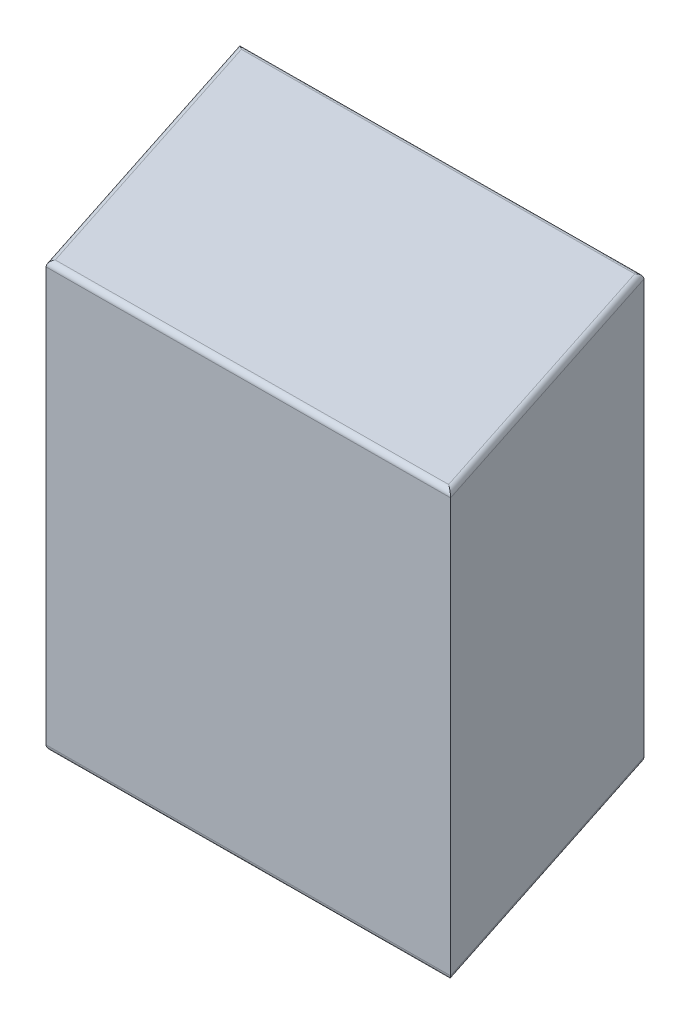
ISO-10303-21;
HEADER;
FILE_DESCRIPTION(('STEP AP214'),'2;1');
FILE_NAME('part.step','',(''),(''),'','','');
FILE_SCHEMA(('AUTOMOTIVE_DESIGN { 1 0 10303 214 1 1 1 1 }'));
ENDSEC;
DATA;
#1=APPLICATION_CONTEXT('core data for automotive mechanical design processes');
#2=APPLICATION_PROTOCOL_DEFINITION('international standard','automotive_design',2000,#1);
#3=PRODUCT_CONTEXT('',#1,'mechanical');
#4=PRODUCT('Part','Part','',(#3));
#5=PRODUCT_RELATED_PRODUCT_CATEGORY('part','',(#4));
#6=PRODUCT_DEFINITION_FORMATION('','',#4);
#7=PRODUCT_DEFINITION_CONTEXT('part definition',#1,'design');
#8=PRODUCT_DEFINITION('design','',#6,#7);
#9=PRODUCT_DEFINITION_SHAPE('','',#8);
#10=(LENGTH_UNIT() NAMED_UNIT(*) SI_UNIT(.MILLI.,.METRE.));
#11=(NAMED_UNIT(*) PLANE_ANGLE_UNIT() SI_UNIT($,.RADIAN.));
#12=(NAMED_UNIT(*) SI_UNIT($,.STERADIAN.) SOLID_ANGLE_UNIT());
#13=UNCERTAINTY_MEASURE_WITH_UNIT(LENGTH_MEASURE(1.E-05),#10,'distance_accuracy_value','');
#14=(GEOMETRIC_REPRESENTATION_CONTEXT(3) GLOBAL_UNCERTAINTY_ASSIGNED_CONTEXT((#13)) GLOBAL_UNIT_ASSIGNED_CONTEXT((#10,
#11,#12)) REPRESENTATION_CONTEXT('',''));
#15=CARTESIAN_POINT('',(0.,0.,0.));
#16=DIRECTION('',(0.,0.,1.));
#17=DIRECTION('',(1.,0.,0.));
#18=AXIS2_PLACEMENT_3D('',#15,#16,#17);
#19=CARTESIAN_POINT('',(38.2775881618389,40.,-0.133334243053111));
#20=DIRECTION('',(-0.00572683030423124,0.,-0.999983601572879));
#21=DIRECTION('',(-0.999983601572879,0.,0.00572683030423124));
#22=AXIS2_PLACEMENT_3D('',#19,#20,#21);
#23=PLANE('',#22);
#24=DIRECTION('',(0.,-1.,0.));
#25=VECTOR('',#24,1.);
#26=CARTESIAN_POINT('',(0.376890978613207,40.,0.0837201774783735));
#27=LINE('',#26,#25);
#28=CARTESIAN_POINT('',(0.376890978613207,39.5,0.0837201774783735));
#29=VERTEX_POINT('',#28);
#30=CARTESIAN_POINT('',(0.376890978613207,0.5,0.0837201774783735));
#31=VERTEX_POINT('',#30);
#32=EDGE_CURVE('E163',#29,#31,#27,.T.);
#33=ORIENTED_EDGE('',*,*,#32,.T.);
#34=DIRECTION('',(0.999983601572879,0.,-0.00572683030423124));
#35=VECTOR('',#34,1.);
#36=CARTESIAN_POINT('',(38.2775881618389,0.5,-0.133334243053111));
#37=LINE('',#36,#35);
#38=CARTESIAN_POINT('',(38.2775881618389,0.5,-0.133334243053111));
#39=VERTEX_POINT('',#38);
#40=EDGE_CURVE('E130',#31,#39,#37,.T.);
#41=ORIENTED_EDGE('',*,*,#40,.T.);
#42=DIRECTION('',(0.,-1.,0.));
#43=VECTOR('',#42,1.);
#44=CARTESIAN_POINT('',(38.2775881618389,40.,-0.133334243053111));
#45=LINE('',#44,#43);
#46=CARTESIAN_POINT('',(38.2775881618389,39.5,-0.133334243053111));
#47=VERTEX_POINT('',#46);
#48=EDGE_CURVE('E114',#47,#39,#45,.T.);
#49=ORIENTED_EDGE('',*,*,#48,.F.);
#50=DIRECTION('',(0.999983601572879,0.,-0.00572683030423124));
#51=VECTOR('',#50,1.);
#52=CARTESIAN_POINT('',(38.2775881618389,39.5,-0.133334243053111));
#53=LINE('',#52,#51);
#54=EDGE_CURVE('E127',#47,#29,#53,.F.);
#55=ORIENTED_EDGE('',*,*,#54,.T.);
#56=EDGE_LOOP('',(#33,#41,#49,#55));
#57=FACE_BOUND('',#56,.T.);
#58=ADVANCED_FACE('F43',(#57),#23,.F.);
#59=CARTESIAN_POINT('',(29.537452899368,40.,-27.0837229155534));
#60=DIRECTION('',(-0.951228322201496,0.,0.308487729159083));
#61=DIRECTION('',(0.308487729159083,0.,0.951228322201496));
#62=AXIS2_PLACEMENT_3D('',#59,#60,#61);
#63=PLANE('',#62);
#64=ORIENTED_EDGE('',*,*,#48,.T.);
#65=DIRECTION('',(-0.308487729159083,0.,-0.951228322201496));
#66=VECTOR('',#65,1.);
#67=CARTESIAN_POINT('',(29.537452899368,0.5,-27.0837229155534));
#68=LINE('',#67,#66);
#69=CARTESIAN_POINT('',(29.537452899368,0.5,-27.0837229155534));
#70=VERTEX_POINT('',#69);
#71=EDGE_CURVE('E120',#39,#70,#68,.T.);
#72=ORIENTED_EDGE('',*,*,#71,.T.);
#73=DIRECTION('',(0.,-1.,0.));
#74=VECTOR('',#73,1.);
#75=CARTESIAN_POINT('',(29.537452899368,40.,-27.0837229155534));
#76=LINE('',#75,#74);
#77=CARTESIAN_POINT('',(29.537452899368,39.5,-27.0837229155534));
#78=VERTEX_POINT('',#77);
#79=EDGE_CURVE('E116',#78,#70,#76,.T.);
#80=ORIENTED_EDGE('',*,*,#79,.F.);
#81=DIRECTION('',(-0.308487729159083,0.,-0.951228322201496));
#82=VECTOR('',#81,1.);
#83=CARTESIAN_POINT('',(29.537452899368,39.5,-27.0837229155534));
#84=LINE('',#83,#82);
#85=EDGE_CURVE('E111',#78,#47,#84,.F.);
#86=ORIENTED_EDGE('',*,*,#85,.T.);
#87=EDGE_LOOP('',(#64,#72,#80,#86));
#88=FACE_BOUND('',#87,.T.);
#89=ADVANCED_FACE('F113',(#88),#63,.F.);
#90=CARTESIAN_POINT('',(-8.36324428385767,40.,-26.866668495022));
#91=DIRECTION('',(0.005726830304231,0.,0.999983601572879));
#92=DIRECTION('',(0.999983601572879,0.,-0.005726830304231));
#93=AXIS2_PLACEMENT_3D('',#90,#91,#92);
#94=PLANE('',#93);
#95=ORIENTED_EDGE('',*,*,#79,.T.);
#96=DIRECTION('',(-0.999983601572879,0.,0.005726830304231));
#97=VECTOR('',#96,1.);
#98=CARTESIAN_POINT('',(-8.36324428385767,0.5,-26.866668495022));
#99=LINE('',#98,#97);
#100=CARTESIAN_POINT('',(-8.36324428385767,0.5,-26.866668495022));
#101=VERTEX_POINT('',#100);
#102=EDGE_CURVE('E187',#70,#101,#99,.T.);
#103=ORIENTED_EDGE('',*,*,#102,.T.);
#104=DIRECTION('',(0.,-1.,0.));
#105=VECTOR('',#104,1.);
#106=CARTESIAN_POINT('',(-8.36324428385767,40.,-26.866668495022));
#107=LINE('',#106,#105);
#108=CARTESIAN_POINT('',(-8.36324428385767,39.5,-26.866668495022));
#109=VERTEX_POINT('',#108);
#110=EDGE_CURVE('E168',#109,#101,#107,.T.);
#111=ORIENTED_EDGE('',*,*,#110,.F.);
#112=DIRECTION('',(-0.999983601572879,0.,0.005726830304231));
#113=VECTOR('',#112,1.);
#114=CARTESIAN_POINT('',(-8.36324428385767,39.5,-26.866668495022));
#115=LINE('',#114,#113);
#116=EDGE_CURVE('E185',#109,#78,#115,.F.);
#117=ORIENTED_EDGE('',*,*,#116,.T.);
#118=EDGE_LOOP('',(#95,#103,#111,#117));
#119=FACE_BOUND('',#118,.T.);
#120=ADVANCED_FACE('F204',(#119),#94,.F.);
#121=CARTESIAN_POINT('',(0.376890978613207,40.,0.0837201774783735));
#122=DIRECTION('',(0.951228322201496,0.,-0.308487729159083));
#123=DIRECTION('',(-0.308487729159083,0.,-0.951228322201496));
#124=AXIS2_PLACEMENT_3D('',#121,#122,#123);
#125=PLANE('',#124);
#126=ORIENTED_EDGE('',*,*,#110,.T.);
#127=DIRECTION('',(0.308487729159083,0.,0.951228322201496));
#128=VECTOR('',#127,1.);
#129=CARTESIAN_POINT('',(0.376890978613207,0.5,0.0837201774783734));
#130=LINE('',#129,#128);
#131=EDGE_CURVE('E191',#101,#31,#130,.T.);
#132=ORIENTED_EDGE('',*,*,#131,.T.);
#133=ORIENTED_EDGE('',*,*,#32,.F.);
#134=DIRECTION('',(0.308487729159083,0.,0.951228322201496));
#135=VECTOR('',#134,1.);
#136=CARTESIAN_POINT('',(0.376890978613207,39.5,0.0837201774783735));
#137=LINE('',#136,#135);
#138=EDGE_CURVE('E189',#29,#109,#137,.F.);
#139=ORIENTED_EDGE('',*,*,#138,.T.);
#140=EDGE_LOOP('',(#126,#132,#133,#139));
#141=FACE_BOUND('',#140,.T.);
#142=ADVANCED_FACE('F202',(#141),#125,.F.);
#143=CARTESIAN_POINT('',(0.,40.,0.));
#144=DIRECTION('',(0.,-1.,0.));
#145=DIRECTION('',(0.,0.,-1.));
#146=AXIS2_PLACEMENT_3D('',#143,#144,#145);
#147=PLANE('',#146);
#148=DIRECTION('',(0.308487729159083,0.,0.951228322201496));
#149=VECTOR('',#148,1.);
#150=CARTESIAN_POINT('',(0.792071392192727,40.,-0.256872403193278));
#151=LINE('',#150,#149);
#152=CARTESIAN_POINT('',(-7.67672820722288,40.,-26.3705919212184));
#153=VERTEX_POINT('',#152);
#154=CARTESIAN_POINT('',(0.739698341823154,40.,-0.418365792144037));
#155=VERTEX_POINT('',#154);
#156=EDGE_CURVE('E193',#153,#155,#151,.T.);
#157=ORIENTED_EDGE('',*,*,#156,.T.);
#158=DIRECTION('',(0.999983601572879,0.,-0.00572683030423124));
#159=VECTOR('',#158,1.);
#160=CARTESIAN_POINT('',(-0.00237161102776172,40.,-0.414116013760509));
#161=LINE('',#160,#159);
#162=CARTESIAN_POINT('',(37.5910720852041,40.,-0.629410816856639));
#163=VERTEX_POINT('',#162);
#164=EDGE_CURVE('E11',#155,#163,#161,.T.);
#165=ORIENTED_EDGE('',*,*,#164,.T.);
#166=DIRECTION('',(-0.308487729159083,0.,-0.951228322201496));
#167=VECTOR('',#166,1.);
#168=CARTESIAN_POINT('',(34.1984255111126,40.,-11.090707015875));
#169=LINE('',#168,#167);
#170=CARTESIAN_POINT('',(29.1746455361581,40.,-26.581636945931));
#171=VERTEX_POINT('',#170);
#172=EDGE_CURVE('E52',#163,#171,#169,.T.);
#173=ORIENTED_EDGE('',*,*,#172,.T.);
#174=DIRECTION('',(-0.999983601572879,0.,0.005726830304231));
#175=VECTOR('',#174,1.);
#176=CARTESIAN_POINT('',(-0.151269198937767,40.,-26.4136896546554));
#177=LINE('',#176,#175);
#178=EDGE_CURVE('E195',#171,#153,#177,.T.);
#179=ORIENTED_EDGE('',*,*,#178,.T.);
#180=EDGE_LOOP('',(#157,#165,#173,#179));
#181=FACE_BOUND('',#180,.T.);
#182=ADVANCED_FACE('F196',(#181),#147,.F.);
#183=CARTESIAN_POINT('',(0.,0.,0.));
#184=DIRECTION('',(0.,-1.,0.));
#185=DIRECTION('',(0.,0.,-1.));
#186=AXIS2_PLACEMENT_3D('',#183,#184,#185);
#187=PLANE('',#186);
#188=DIRECTION('',(-0.308487729159083,0.,-0.951228322201496));
#189=VECTOR('',#188,1.);
#190=CARTESIAN_POINT('',(37.8019740007381,0.,0.020909621526434));
#191=LINE('',#190,#189);
#192=CARTESIAN_POINT('',(29.1746455361581,0.,-26.581636945931));
#193=VERTEX_POINT('',#192);
#194=CARTESIAN_POINT('',(37.5910720852041,0.,-0.62941081685664));
#195=VERTEX_POINT('',#194);
#196=EDGE_CURVE('E180',#193,#195,#191,.F.);
#197=ORIENTED_EDGE('',*,*,#196,.T.);
#198=DIRECTION('',(0.999983601572879,0.,-0.00572683030423124));
#199=VECTOR('',#198,1.);
#200=CARTESIAN_POINT('',(0.374027563461082,0.,-0.416271623308066));
#201=LINE('',#200,#199);
#202=CARTESIAN_POINT('',(0.739698341823154,0.,-0.418365792144037));
#203=VERTEX_POINT('',#202);
#204=EDGE_CURVE('E121',#195,#203,#201,.F.);
#205=ORIENTED_EDGE('',*,*,#204,.T.);
#206=DIRECTION('',(0.308487729159083,0.,0.951228322201496));
#207=VECTOR('',#206,1.);
#208=CARTESIAN_POINT('',(-7.88763012275693,0.,-27.0209123596015));
#209=LINE('',#208,#207);
#210=CARTESIAN_POINT('',(-7.67672820722288,0.,-26.3705919212184));
#211=VERTEX_POINT('',#210);
#212=EDGE_CURVE('E176',#203,#211,#209,.F.);
#213=ORIENTED_EDGE('',*,*,#212,.T.);
#214=DIRECTION('',(-0.999983601572879,0.,0.005726830304231));
#215=VECTOR('',#214,1.);
#216=CARTESIAN_POINT('',(29.5403163145201,0.,-26.583731114767));
#217=LINE('',#216,#215);
#218=EDGE_CURVE('E178',#211,#193,#217,.F.);
#219=ORIENTED_EDGE('',*,*,#218,.T.);
#220=EDGE_LOOP('',(#197,#205,#213,#219));
#221=FACE_BOUND('',#220,.T.);
#222=ADVANCED_FACE('F230',(#221),#187,.T.);
#223=CARTESIAN_POINT('',(-8.36038086870556,0.5,-26.3666766942355));
#224=DIRECTION('',(0.999983601572879,0.,-0.005726830304231));
#225=DIRECTION('',(-0.005726830304231,0.,-0.999983601572879));
#226=AXIS2_PLACEMENT_3D('',#223,#224,#225);
#227=CYLINDRICAL_SURFACE('',#226,0.5);
#228=CARTESIAN_POINT('',(29.1746455361581,0.5,-26.581636945931));
#229=DIRECTION('',(0.810533834465707,0.,0.58569181587787));
#230=DIRECTION('',(0.585691815877871,0.,-0.810533834465707));
#231=AXIS2_PLACEMENT_3D('',#228,#229,#230);
#232=ELLIPSE('',#231,0.619450969561781,0.5);
#233=EDGE_CURVE('E155',#193,#70,#232,.T.);
#234=ORIENTED_EDGE('',*,*,#233,.F.);
#235=ORIENTED_EDGE('',*,*,#218,.F.);
#236=CARTESIAN_POINT('',(-7.67672820722288,0.5,-26.3705919212184));
#237=DIRECTION('',(0.585691815877871,0.,-0.810533834465707));
#238=DIRECTION('',(-0.810533834465707,0.,-0.58569181587787));
#239=AXIS2_PLACEMENT_3D('',#236,#237,#238);
#240=ELLIPSE('',#239,0.846992497342614,0.5);
#241=EDGE_CURVE('E142',#101,#211,#240,.F.);
#242=ORIENTED_EDGE('',*,*,#241,.F.);
#243=ORIENTED_EDGE('',*,*,#102,.F.);
#244=EDGE_LOOP('',(#234,#235,#242,#243));
#245=FACE_BOUND('',#244,.T.);
#246=ADVANCED_FACE('F207',(#245),#227,.T.);
#247=CARTESIAN_POINT('',(0.852505139713954,0.5,-0.070523687101168));
#248=DIRECTION('',(-0.308487729159083,0.,-0.951228322201496));
#249=DIRECTION('',(-0.951228322201496,0.,0.308487729159083));
#250=AXIS2_PLACEMENT_3D('',#247,#248,#249);
#251=CYLINDRICAL_SURFACE('',#250,0.5);
#252=ORIENTED_EDGE('',*,*,#241,.T.);
#253=ORIENTED_EDGE('',*,*,#212,.F.);
#254=CARTESIAN_POINT('',(0.739698341823148,0.5,-0.418365792144039));
#255=DIRECTION('',(-0.810533834465707,0.,-0.585691815877871));
#256=DIRECTION('',(0.58569181587787,0.,-0.810533834465707));
#257=AXIS2_PLACEMENT_3D('',#254,#255,#256);
#258=ELLIPSE('',#257,0.619450969561781,0.5);
#259=EDGE_CURVE('E149',#31,#203,#258,.F.);
#260=ORIENTED_EDGE('',*,*,#259,.F.);
#261=ORIENTED_EDGE('',*,*,#131,.F.);
#262=EDGE_LOOP('',(#252,#253,#260,#261));
#263=FACE_BOUND('',#262,.T.);
#264=ADVANCED_FACE('F209',(#263),#251,.T.);
#265=CARTESIAN_POINT('',(29.0618387382673,0.5,-26.9294790509739));
#266=DIRECTION('',(0.308487729159083,0.,0.951228322201496));
#267=DIRECTION('',(0.951228322201496,0.,-0.308487729159083));
#268=AXIS2_PLACEMENT_3D('',#265,#266,#267);
#269=CYLINDRICAL_SURFACE('',#268,0.5);
#270=ORIENTED_EDGE('',*,*,#233,.T.);
#271=ORIENTED_EDGE('',*,*,#71,.F.);
#272=CARTESIAN_POINT('',(37.5910720852041,0.5,-0.629410816856639));
#273=DIRECTION('',(-0.585691815877871,0.,0.810533834465707));
#274=DIRECTION('',(0.810533834465707,0.,0.585691815877871));
#275=AXIS2_PLACEMENT_3D('',#272,#273,#274);
#276=ELLIPSE('',#275,0.846992497342614,0.5);
#277=EDGE_CURVE('E145',#195,#39,#276,.T.);
#278=ORIENTED_EDGE('',*,*,#277,.F.);
#279=ORIENTED_EDGE('',*,*,#196,.F.);
#280=EDGE_LOOP('',(#270,#271,#278,#279));
#281=FACE_BOUND('',#280,.T.);
#282=ADVANCED_FACE('F212',(#281),#269,.T.);
#283=CARTESIAN_POINT('',(38.2747247466868,0.5,-0.633326043839551));
#284=DIRECTION('',(-0.999983601572879,0.,0.00572683030423124));
#285=DIRECTION('',(0.00572683030423124,0.,0.999983601572879));
#286=AXIS2_PLACEMENT_3D('',#283,#284,#285);
#287=CYLINDRICAL_SURFACE('',#286,0.5);
#288=ORIENTED_EDGE('',*,*,#259,.T.);
#289=ORIENTED_EDGE('',*,*,#204,.F.);
#290=ORIENTED_EDGE('',*,*,#277,.T.);
#291=ORIENTED_EDGE('',*,*,#40,.F.);
#292=EDGE_LOOP('',(#288,#289,#290,#291));
#293=FACE_BOUND('',#292,.T.);
#294=ADVANCED_FACE('F210',(#293),#287,.T.);
#295=CARTESIAN_POINT('',(-0.151269198937768,39.5,-26.4136896546554));
#296=DIRECTION('',(-0.999983601572879,0.,0.005726830304231));
#297=DIRECTION('',(0.005726830304231,0.,0.999983601572879));
#298=AXIS2_PLACEMENT_3D('',#295,#296,#297);
#299=CYLINDRICAL_SURFACE('',#298,0.5);
#300=CARTESIAN_POINT('',(29.174645536158,39.5,-26.581636945931));
#301=DIRECTION('',(-0.810533834465707,0.,-0.58569181587787));
#302=DIRECTION('',(-0.585691815877871,0.,0.810533834465707));
#303=AXIS2_PLACEMENT_3D('',#300,#301,#302);
#304=ELLIPSE('',#303,0.619450969561781,0.5);
#305=EDGE_CURVE('E139',#78,#171,#304,.F.);
#306=ORIENTED_EDGE('',*,*,#305,.F.);
#307=ORIENTED_EDGE('',*,*,#116,.F.);
#308=CARTESIAN_POINT('',(-7.67672820722288,39.5,-26.3705919212184));
#309=DIRECTION('',(-0.585691815877871,0.,0.810533834465707));
#310=DIRECTION('',(0.810533834465707,0.,0.58569181587787));
#311=AXIS2_PLACEMENT_3D('',#308,#309,#310);
#312=ELLIPSE('',#311,0.846992497342614,0.5);
#313=EDGE_CURVE('E47',#153,#109,#312,.T.);
#314=ORIENTED_EDGE('',*,*,#313,.F.);
#315=ORIENTED_EDGE('',*,*,#178,.F.);
#316=EDGE_LOOP('',(#306,#307,#314,#315));
#317=FACE_BOUND('',#316,.T.);
#318=ADVANCED_FACE('F45',(#317),#299,.T.);
#319=CARTESIAN_POINT('',(0.792071392192727,39.5,-0.256872403193278));
#320=DIRECTION('',(0.308487729159083,0.,0.951228322201496));
#321=DIRECTION('',(0.951228322201496,0.,-0.308487729159083));
#322=AXIS2_PLACEMENT_3D('',#319,#320,#321);
#323=CYLINDRICAL_SURFACE('',#322,0.5);
#324=ORIENTED_EDGE('',*,*,#313,.T.);
#325=ORIENTED_EDGE('',*,*,#138,.F.);
#326=CARTESIAN_POINT('',(0.739698341823154,39.5,-0.418365792144037));
#327=DIRECTION('',(0.810533834465707,0.,0.585691815877871));
#328=DIRECTION('',(-0.58569181587787,0.,0.810533834465707));
#329=AXIS2_PLACEMENT_3D('',#326,#327,#328);
#330=ELLIPSE('',#329,0.619450969561781,0.5);
#331=EDGE_CURVE('E134',#155,#29,#330,.T.);
#332=ORIENTED_EDGE('',*,*,#331,.F.);
#333=ORIENTED_EDGE('',*,*,#156,.F.);
#334=EDGE_LOOP('',(#324,#325,#332,#333));
#335=FACE_BOUND('',#334,.T.);
#336=ADVANCED_FACE('F199',(#335),#323,.T.);
#337=CARTESIAN_POINT('',(34.1984255111126,39.5,-11.090707015875));
#338=DIRECTION('',(-0.308487729159083,0.,-0.951228322201496));
#339=DIRECTION('',(-0.951228322201496,0.,0.308487729159083));
#340=AXIS2_PLACEMENT_3D('',#337,#338,#339);
#341=CYLINDRICAL_SURFACE('',#340,0.5);
#342=ORIENTED_EDGE('',*,*,#305,.T.);
#343=ORIENTED_EDGE('',*,*,#172,.F.);
#344=CARTESIAN_POINT('',(37.5910720852041,39.5,-0.629410816856638));
#345=DIRECTION('',(0.585691815877871,0.,-0.810533834465707));
#346=DIRECTION('',(-0.810533834465707,0.,-0.585691815877871));
#347=AXIS2_PLACEMENT_3D('',#344,#345,#346);
#348=ELLIPSE('',#347,0.846992497342614,0.5);
#349=EDGE_CURVE('E60',#47,#163,#348,.F.);
#350=ORIENTED_EDGE('',*,*,#349,.F.);
#351=ORIENTED_EDGE('',*,*,#85,.F.);
#352=EDGE_LOOP('',(#342,#343,#350,#351));
#353=FACE_BOUND('',#352,.T.);
#354=ADVANCED_FACE('F137',(#353),#341,.T.);
#355=CARTESIAN_POINT('',(-0.00237161102776172,39.5,-0.414116013760509));
#356=DIRECTION('',(0.999983601572879,0.,-0.00572683030423124));
#357=DIRECTION('',(-0.00572683030423124,0.,-0.999983601572879));
#358=AXIS2_PLACEMENT_3D('',#355,#356,#357);
#359=CYLINDRICAL_SURFACE('',#358,0.5);
#360=ORIENTED_EDGE('',*,*,#331,.T.);
#361=ORIENTED_EDGE('',*,*,#54,.F.);
#362=ORIENTED_EDGE('',*,*,#349,.T.);
#363=ORIENTED_EDGE('',*,*,#164,.F.);
#364=EDGE_LOOP('',(#360,#361,#362,#363));
#365=FACE_BOUND('',#364,.T.);
#366=ADVANCED_FACE('F132',(#365),#359,.T.);
#367=CLOSED_SHELL('',(#58,#89,#120,#142,#182,#222,#246,#264,#282,#294,#318,#336,#354,#366));
#368=MANIFOLD_SOLID_BREP('B2',#367);
#369=ADVANCED_BREP_SHAPE_REPRESENTATION('',(#18,#368),#14);
#370=SHAPE_DEFINITION_REPRESENTATION(#9,#369);
ENDSEC;
END-ISO-10303-21;
